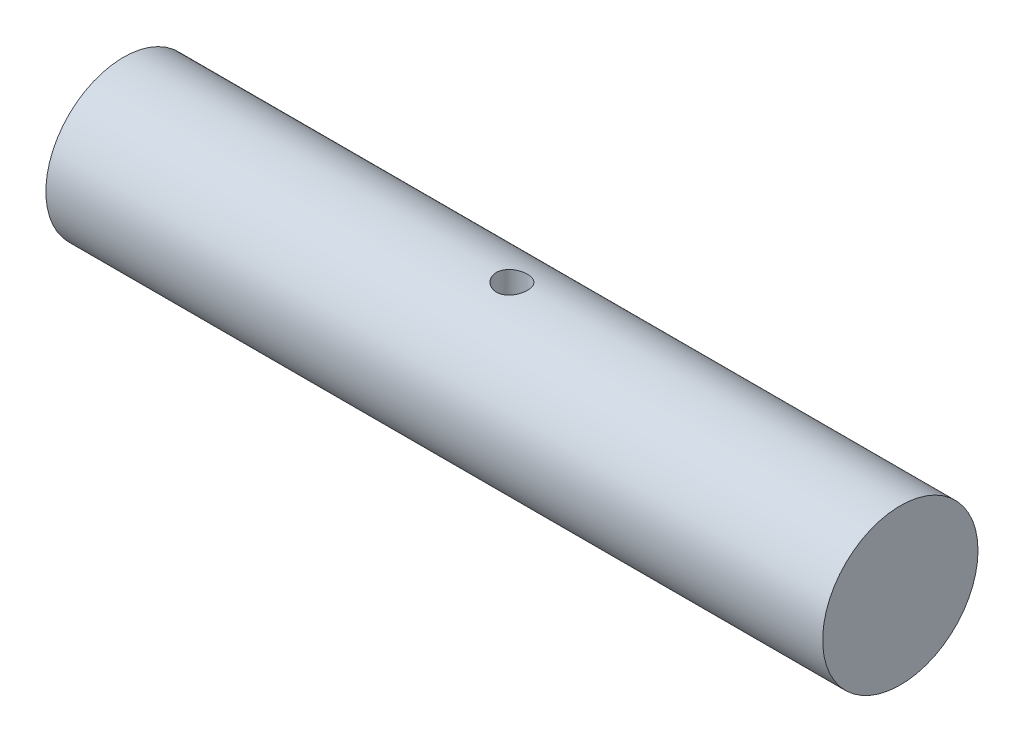
ISO-10303-21;
HEADER;
FILE_DESCRIPTION(('STEP AP214'),'2;1');
FILE_NAME('part.step','',(''),(''),'','','');
FILE_SCHEMA(('AUTOMOTIVE_DESIGN { 1 0 10303 214 1 1 1 1 }'));
ENDSEC;
DATA;
#1=APPLICATION_CONTEXT('core data for automotive mechanical design processes');
#2=APPLICATION_PROTOCOL_DEFINITION('international standard','automotive_design',2000,#1);
#3=PRODUCT_CONTEXT('',#1,'mechanical');
#4=PRODUCT('Part','Part','',(#3));
#5=PRODUCT_RELATED_PRODUCT_CATEGORY('part','',(#4));
#6=PRODUCT_DEFINITION_FORMATION('','',#4);
#7=PRODUCT_DEFINITION_CONTEXT('part definition',#1,'design');
#8=PRODUCT_DEFINITION('design','',#6,#7);
#9=PRODUCT_DEFINITION_SHAPE('','',#8);
#10=(LENGTH_UNIT() NAMED_UNIT(*) SI_UNIT(.MILLI.,.METRE.));
#11=(NAMED_UNIT(*) PLANE_ANGLE_UNIT() SI_UNIT($,.RADIAN.));
#12=(NAMED_UNIT(*) SI_UNIT($,.STERADIAN.) SOLID_ANGLE_UNIT());
#13=UNCERTAINTY_MEASURE_WITH_UNIT(LENGTH_MEASURE(1.E-05),#10,'distance_accuracy_value','');
#14=(GEOMETRIC_REPRESENTATION_CONTEXT(3) GLOBAL_UNCERTAINTY_ASSIGNED_CONTEXT((#13)) GLOBAL_UNIT_ASSIGNED_CONTEXT((#10,
#11,#12)) REPRESENTATION_CONTEXT('',''));
#15=CARTESIAN_POINT('',(0.,0.,0.));
#16=DIRECTION('',(0.,0.,1.));
#17=DIRECTION('',(1.,0.,0.));
#18=AXIS2_PLACEMENT_3D('',#15,#16,#17);
#19=CARTESIAN_POINT('',(125.,0.,0.));
#20=DIRECTION('',(-1.,0.,0.));
#21=DIRECTION('',(0.,0.,1.));
#22=AXIS2_PLACEMENT_3D('',#19,#20,#21);
#23=CYLINDRICAL_SURFACE('',#22,25.);
#24=CARTESIAN_POINT('',(-5.,-25.,0.));
#25=CARTESIAN_POINT('',(-5.00000276944634,-25.0000014065203,0.138987493787324));
#26=CARTESIAN_POINT('',(-4.99420324928108,-24.9988389427216,0.277940302046087));
#27=CARTESIAN_POINT('',(-4.97105635129736,-24.994224565157,0.554886864496204));
#28=CARTESIAN_POINT('',(-4.95370679489748,-24.9907722194715,0.692880432791919));
#29=CARTESIAN_POINT('',(-4.90758143771224,-24.981670242636,0.96693714850388));
#30=CARTESIAN_POINT('',(-4.87879984551409,-24.9760194978176,1.10299928122357));
#31=CARTESIAN_POINT('',(-4.81002534910899,-24.9626762565998,1.37221108352448));
#32=CARTESIAN_POINT('',(-4.7700283237777,-24.9549830097359,1.50535966309261));
#33=CARTESIAN_POINT('',(-4.67919625225817,-24.9377804442932,1.76758319373794));
#34=CARTESIAN_POINT('',(-4.6283758297848,-24.9282735779222,1.896663374225));
#35=CARTESIAN_POINT('',(-4.51622401781226,-24.9076944208426,2.15009997814349));
#36=CARTESIAN_POINT('',(-4.45488875234116,-24.8966215531404,2.2744546389337));
#37=CARTESIAN_POINT('',(-4.32219456929056,-24.8732206370355,2.51749782000809));
#38=CARTESIAN_POINT('',(-4.25084014170608,-24.8608931515555,2.63618884664851));
#39=CARTESIAN_POINT('',(-4.09856036475226,-24.8353088041128,2.86722020463685));
#40=CARTESIAN_POINT('',(-4.01763144246466,-24.8220515959613,2.97955814193969));
#41=CARTESIAN_POINT('',(-3.84577119317021,-24.7948114657324,3.1983785388143));
#42=CARTESIAN_POINT('',(-3.75473335664577,-24.780821838943,3.30477652475172));
#43=CARTESIAN_POINT('',(-3.56403766796451,-24.7526457290753,3.50958996762926));
#44=CARTESIAN_POINT('',(-3.46437663408191,-24.738459174971,3.60800245195942));
#45=CARTESIAN_POINT('',(-3.25716556407393,-24.7102933832022,3.79610927604841));
#46=CARTESIAN_POINT('',(-3.14961781123659,-24.6963140869323,3.88580612172819));
#47=CARTESIAN_POINT('',(-2.92729283454244,-24.6689453876667,4.05592901668139));
#48=CARTESIAN_POINT('',(-2.81251295883554,-24.6555562041458,4.13635163435981));
#49=CARTESIAN_POINT('',(-2.57548415685045,-24.6296394657581,4.28798741229219));
#50=CARTESIAN_POINT('',(-2.4531786550123,-24.6171204770982,4.35911381454495));
#51=CARTESIAN_POINT('',(-2.20287125287649,-24.5934353082732,4.49081269831453));
#52=CARTESIAN_POINT('',(-2.07486723801243,-24.5822696361062,4.55138122040544));
#53=CARTESIAN_POINT('',(-1.6837416438572,-24.5513304070068,4.71644727257975));
#54=CARTESIAN_POINT('',(-1.41321932460559,-24.5340820165952,4.8044888260482));
#55=CARTESIAN_POINT('',(-0.864538565206146,-24.508635793463,4.93264780265691));
#56=CARTESIAN_POINT('',(-0.586526670293087,-24.5003223072134,4.97337819482265));
#57=CARTESIAN_POINT('',(-0.0274615011239772,-24.4933199482487,5.00775493418216));
#58=CARTESIAN_POINT('',(0.253591459209596,-24.4946300913956,5.00140609582258));
#59=CARTESIAN_POINT('',(0.806236719928547,-24.5066272442008,4.94227436036826));
#60=CARTESIAN_POINT('',(1.07790777317425,-24.5171725589932,4.89019310186595));
#61=CARTESIAN_POINT('',(1.60857963824175,-24.546227391949,4.7421890224497));
#62=CARTESIAN_POINT('',(1.86757984431989,-24.5647372904543,4.64626410780486));
#63=CARTESIAN_POINT('',(2.36757651014679,-24.6077809023025,4.41262402680007));
#64=CARTESIAN_POINT('',(2.60843945190753,-24.632354484594,4.27463078523214));
#65=CARTESIAN_POINT('',(3.06385419579618,-24.684730944745,3.96096784378848));
#66=CARTESIAN_POINT('',(3.27840296964697,-24.7125341935642,3.78529381392922));
#67=CARTESIAN_POINT('',(3.6791470271563,-24.7688510603976,3.39749968079915));
#68=CARTESIAN_POINT('',(3.86476284328655,-24.797368460096,3.18478080820446));
#69=CARTESIAN_POINT('',(4.19776922751518,-24.8514424361697,2.73092511816778));
#70=CARTESIAN_POINT('',(4.345159305376,-24.8769989745701,2.48978793632426));
#71=CARTESIAN_POINT('',(4.59763754722347,-24.9223345079227,1.98529693496818));
#72=CARTESIAN_POINT('',(4.70265946859707,-24.9421044423773,1.72190909807365));
#73=CARTESIAN_POINT('',(4.86680236981849,-24.9735704494292,1.18074488209619));
#74=CARTESIAN_POINT('',(4.92592890996419,-24.98526750005,0.902970250347199));
#75=CARTESIAN_POINT('',(4.99578226936858,-24.9991335933204,0.345897028150548));
#76=CARTESIAN_POINT('',(5.0073020989149,-25.0014587325673,0.0667016415443218));
#77=CARTESIAN_POINT('',(4.98375070407561,-24.9967525965614,-0.489624670880018));
#78=CARTESIAN_POINT('',(4.94868209878037,-24.9897218472742,-0.766755711869967));
#79=CARTESIAN_POINT('',(4.8336081366968,-24.9671916002008,-1.30852830007856));
#80=CARTESIAN_POINT('',(4.75400967390563,-24.9517688194687,-1.57325974299468));
#81=CARTESIAN_POINT('',(4.55258007032458,-24.9141776037933,-2.08561813620307));
#82=CARTESIAN_POINT('',(4.43074576544514,-24.892008663478,-2.33324380335236));
#83=CARTESIAN_POINT('',(4.14658760866303,-24.8429955738642,-2.80770587332562));
#84=CARTESIAN_POINT('',(3.98378632719944,-24.8160975113418,-3.03425065213174));
#85=CARTESIAN_POINT('',(3.62295381154451,-24.760736752006,-3.45709007722326));
#86=CARTESIAN_POINT('',(3.42491880020732,-24.7322738876682,-3.65338147605435));
#87=CARTESIAN_POINT('',(2.9956341215523,-24.6764651380018,-4.01320302351496));
#88=CARTESIAN_POINT('',(2.76392459020512,-24.6491428619003,-4.17618877400404));
#89=CARTESIAN_POINT('',(2.2759398820373,-24.5992097395686,-4.46092683850573));
#90=CARTESIAN_POINT('',(2.01966568861743,-24.5765987048474,-4.58268080227279));
#91=CARTESIAN_POINT('',(1.49117106774616,-24.5388364729789,-4.78076018011429));
#92=CARTESIAN_POINT('',(1.21904158214295,-24.5236466726876,-4.85732111853824));
#93=CARTESIAN_POINT('',(0.665286950415527,-24.5023739077135,-4.96353963899985));
#94=CARTESIAN_POINT('',(0.383663047477872,-24.4962897554484,-4.9932033375265));
#95=CARTESIAN_POINT('',(-0.0366703889550757,-24.4945288792509,-5.00179339144585));
#96=CARTESIAN_POINT('',(-0.175226568149242,-24.4951330184965,-4.99885021968412));
#97=CARTESIAN_POINT('',(-0.451573795714482,-24.4986714739674,-4.98148651470878));
#98=CARTESIAN_POINT('',(-0.589365114475224,-24.5016049058833,-4.9670703371849));
#99=CARTESIAN_POINT('',(-0.863249015919121,-24.5097212135577,-4.92686276339316));
#100=CARTESIAN_POINT('',(-0.99934098696874,-24.5149048765081,-4.90106738632089));
#101=CARTESIAN_POINT('',(-1.26877990573972,-24.5273664043086,-4.83831799577184));
#102=CARTESIAN_POINT('',(-1.40212781468395,-24.5346435219816,-4.80136796328246));
#103=CARTESIAN_POINT('',(-1.66492270056654,-24.5510651803018,-4.71667811844351));
#104=CARTESIAN_POINT('',(-1.79437724530106,-24.5602057877658,-4.66896100938054));
#105=CARTESIAN_POINT('',(-2.0487516964052,-24.5800998692381,-4.56306801677477));
#106=CARTESIAN_POINT('',(-2.17367318845506,-24.5908527723703,-4.5048958336854));
#107=CARTESIAN_POINT('',(-2.41824756272708,-24.6136768592635,-4.37847423732261));
#108=CARTESIAN_POINT('',(-2.53789823177196,-24.6257485895239,-4.31022064232977));
#109=CARTESIAN_POINT('',(-2.77104924549456,-24.6508678052533,-4.1641570153785));
#110=CARTESIAN_POINT('',(-2.88455168170255,-24.6639149552593,-4.08635026305034));
#111=CARTESIAN_POINT('',(-3.10662673529868,-24.6908640955351,-3.92025868558202));
#112=CARTESIAN_POINT('',(-3.21507953970715,-24.7047769949563,-3.83181538764857));
#113=CARTESIAN_POINT('',(-3.42413829635703,-24.7328525343466,-3.64620484015059));
#114=CARTESIAN_POINT('',(-3.5247469916541,-24.7470150848702,-3.54904066604526));
#115=CARTESIAN_POINT('',(-3.71754062080305,-24.7752095204235,-3.34655721556743));
#116=CARTESIAN_POINT('',(-3.80972053177606,-24.7892413231228,-3.24123314471885));
#117=CARTESIAN_POINT('',(-3.98492694002668,-24.8167717117019,-3.02322778921367));
#118=CARTESIAN_POINT('',(-4.06795679324696,-24.8302704919035,-2.91054922625043));
#119=CARTESIAN_POINT('',(-4.22517389711511,-24.8565085935593,-2.67729343786965));
#120=CARTESIAN_POINT('',(-4.29925523105979,-24.869238066002,-2.55664367436167));
#121=CARTESIAN_POINT('',(-4.43694433521666,-24.8934104051449,-2.30944481023434));
#122=CARTESIAN_POINT('',(-4.50055595131359,-24.9048537437938,-2.18289789785573));
#123=CARTESIAN_POINT('',(-4.61682450350034,-24.9261268452451,-1.9248233263731));
#124=CARTESIAN_POINT('',(-4.66948807030048,-24.9359575839567,-1.79329873940675));
#125=CARTESIAN_POINT('',(-4.763487680713,-24.9537310452209,-1.52618442476761));
#126=CARTESIAN_POINT('',(-4.8048259066209,-24.9616741314688,-1.39059548585458));
#127=CARTESIAN_POINT('',(-4.89322312719739,-24.9788087281562,-1.04920215690347));
#128=CARTESIAN_POINT('',(-4.93320981071554,-24.9867141903289,-0.841457494405878));
#129=CARTESIAN_POINT('',(-4.98659571941881,-24.9973086745575,-0.422448453280689));
#130=CARTESIAN_POINT('',(-4.99999579197194,-24.9999978628663,-0.211184187046264));
#131=CARTESIAN_POINT('',(-5.,-25.,0.));
#132=B_SPLINE_CURVE_WITH_KNOTS('',3,(#24,#25,#26,#27,#28,#29,#30,#31,#32,#33,#34,#35,#36,#37,
#38,#39,#40,#41,#42,#43,#44,#45,#46,#47,#48,#49,#50,#51,#52,#53,#54,#55,#56,#57,#58,#59,#60,#61,
#62,#63,#64,#65,#66,#67,#68,#69,#70,#71,#72,#73,#74,#75,#76,#77,#78,#79,#80,#81,#82,#83,#84,#85,
#86,#87,#88,#89,#90,#91,#92,#93,#94,#95,#96,#97,#98,#99,#100,#101,#102,#103,#104,#105,#106,#107,
#108,#109,#110,#111,#112,#113,#114,#115,#116,#117,#118,#119,#120,#121,#122,#123,#124,#125,#126,
#127,#128,#129,#130,#131),.UNSPECIFIED.,.T.,.F.,(4,2,2,2,2,2,2,2,2,2,2,2,2,2,2,2,2,2,2,2,2,2,2,
2,2,2,2,2,2,2,2,2,2,2,2,2,2,2,2,2,2,2,2,2,2,2,2,2,2,2,2,2,2,4),(0.,0.416777047445417,
0.833632730149863,1.25069985977206,1.66792044248879,2.08458084615619,2.50139517036218,
2.91802329572164,3.33480738770838,3.7564966440872,4.17834216132243,4.60006602836891,
5.02194544187045,5.44751701120412,5.87324783701269,6.72369555497643,7.56299734191929,
8.40221330082507,9.22877443707773,10.0553750494503,10.8875625969434,11.7198458242473,
12.5671007113313,13.4143664637548,14.262951829465,15.1114343716656,15.9457248705771,
16.7799684696572,17.6067107843,18.4335150475649,19.2704413884317,20.1074575040603,
20.9572195157251,21.8069475229371,22.6522071384191,23.4973565033242,23.9127168808878,
24.3279196434016,24.7432677723233,25.1584678424529,25.5728004765726,25.9869867501795,
26.4013453111814,26.8155620171985,27.2369706991647,27.6582313488923,28.0797414220244,
28.5010963808509,28.9270309561325,29.3528087202144,29.7783278548953,30.203764937947,
30.8370559265658,31.4703267306209),.UNSPECIFIED.);
#133=CARTESIAN_POINT('',(-5.,-25.,0.));
#134=VERTEX_POINT('',#133);
#135=EDGE_CURVE('E10',#134,#134,#132,.T.);
#136=ORIENTED_EDGE('',*,*,#135,.T.);
#137=EDGE_LOOP('',(#136));
#138=FACE_BOUND('',#137,.T.);
#139=CARTESIAN_POINT('',(0.,24.4948974278318,5.));
#140=CARTESIAN_POINT('',(-0.138956228432175,24.4948959140652,5.00000277932283));
#141=CARTESIAN_POINT('',(-0.277877759427022,24.4960820445244,4.99420583952395));
#142=CARTESIAN_POINT('',(-0.554760910782418,24.5007881327193,4.97106951247274));
#143=CARTESIAN_POINT('',(-0.692722344806998,24.5043085313918,4.95372794446977));
#144=CARTESIAN_POINT('',(-0.966714129081264,24.5135833999899,4.90762442723258));
#145=CARTESIAN_POINT('',(-1.10274345492746,24.5193390123237,4.8788566379347));
#146=CARTESIAN_POINT('',(-1.37188892080659,24.5329168521693,4.8101161975473));
#147=CARTESIAN_POINT('',(-1.50500396886891,24.5407398404405,4.77013942141009));
#148=CARTESIAN_POINT('',(-1.76715614052518,24.5582115919251,4.679356239882));
#149=CARTESIAN_POINT('',(-1.89619864039772,24.5678578195523,4.62856486213672));
#150=CARTESIAN_POINT('',(-2.14956304127907,24.5887102826167,4.51647818958425));
#151=CARTESIAN_POINT('',(-2.27388318016664,24.5999170932378,4.45517901998884));
#152=CARTESIAN_POINT('',(-2.5168633390302,24.6235656382957,4.32256259117468));
#153=CARTESIAN_POINT('',(-2.63552584385088,24.6360068230559,4.25124978528394));
#154=CARTESIAN_POINT('',(-2.86650780331227,24.6617859698465,4.09905714012307));
#155=CARTESIAN_POINT('',(-2.97882486626249,24.6751242659164,4.0181737286281));
#156=CARTESIAN_POINT('',(-3.19767262714864,24.7024933301151,3.84635941756609));
#157=CARTESIAN_POINT('',(-3.30411496524358,24.7165306060046,3.7553169869603));
#158=CARTESIAN_POINT('',(-3.50901761116524,24.7447550172108,3.56460271884441));
#159=CARTESIAN_POINT('',(-3.60747494602792,24.7589422061409,3.46492769556318));
#160=CARTESIAN_POINT('',(-3.79566965444345,24.7870621737417,3.25767968751707));
#161=CARTESIAN_POINT('',(-3.88540959714398,24.80099502638,3.15010904621878));
#162=CARTESIAN_POINT('',(-4.05561553244616,24.8282290266689,2.92772937682517));
#163=CARTESIAN_POINT('',(-4.13607809534407,24.8415299396397,2.81291769594009));
#164=CARTESIAN_POINT('',(-4.28775992933208,24.867232331661,2.57586269555549));
#165=CARTESIAN_POINT('',(-4.35889618572743,24.8796253494226,2.45356521066842));
#166=CARTESIAN_POINT('',(-4.49061561976306,24.9030409030999,2.20327286170085));
#167=CARTESIAN_POINT('',(-4.55119483884866,24.9140629244939,2.0752758829805));
#168=CARTESIAN_POINT('',(-4.71629352646733,24.9445697433125,1.68417147036292));
#169=CARTESIAN_POINT('',(-4.80435684781525,24.9615274484324,1.41366454176391));
#170=CARTESIAN_POINT('',(-4.9325572950363,24.9865205281948,0.865044260538021));
#171=CARTESIAN_POINT('',(-4.97331059941089,24.9946705178815,0.58707808925146));
#172=CARTESIAN_POINT('',(-5.00774904818614,25.001544855821,0.0281034479881241));
#173=CARTESIAN_POINT('',(-5.00143872813593,25.0002701123409,-0.252904726222841));
#174=CARTESIAN_POINT('',(-4.94237059736807,24.9885220591615,-0.805712786453445));
#175=CARTESIAN_POINT('',(-4.89027551576091,24.9781800029126,-1.07758681729645));
#176=CARTESIAN_POINT('',(-4.74217443608932,24.9496087733464,-1.60865738706756));
#177=CARTESIAN_POINT('',(-4.64616668110936,24.93137928446,-1.86785341829837));
#178=CARTESIAN_POINT('',(-4.41234990787511,24.8888648238832,-2.36809751770485));
#179=CARTESIAN_POINT('',(-4.2742812735962,24.8645424148967,-2.60902092474939));
#180=CARTESIAN_POINT('',(-3.96045458469301,24.812523467553,-3.06452517521266));
#181=CARTESIAN_POINT('',(-3.7846921932812,24.7848265411053,-3.27910298301492));
#182=CARTESIAN_POINT('',(-3.39683189746096,24.7285482199077,-3.67975717013201));
#183=CARTESIAN_POINT('',(-3.18415406849625,24.6999598233212,-3.86527158685728));
#184=CARTESIAN_POINT('',(-2.730417785602,24.6455785794926,-4.19809246189484));
#185=CARTESIAN_POINT('',(-2.48935879501062,24.6197857851305,-4.3453981975471));
#186=CARTESIAN_POINT('',(-1.98489584146561,24.5739023737433,-4.5978140751034));
#187=CARTESIAN_POINT('',(-1.72144516194926,24.5538240781191,-4.7028332392629));
#188=CARTESIAN_POINT('',(-1.1801433812325,24.521823816122,-4.86695170776361));
#189=CARTESIAN_POINT('',(-0.902294161888908,24.5099007867518,-4.9260569968798));
#190=CARTESIAN_POINT('',(-0.345175710012984,24.4957739630664,-4.99583003057767));
#191=CARTESIAN_POINT('',(-0.0660121283522959,24.493407351626,-5.00730929570102));
#192=CARTESIAN_POINT('',(0.490241115924468,24.4982242831088,-4.98368814034094));
#193=CARTESIAN_POINT('',(0.767330895246229,24.5054072844901,-4.94859036116145));
#194=CARTESIAN_POINT('',(1.30884320179901,24.5283616252697,-4.83351104478034));
#195=CARTESIAN_POINT('',(1.57336171646508,24.5440499515026,-4.75396312055877));
#196=CARTESIAN_POINT('',(2.08531639385734,24.5821744668054,-4.55270516017897));
#197=CARTESIAN_POINT('',(2.33275114737079,24.6046112117261,-4.43099165081898));
#198=CARTESIAN_POINT('',(2.80706555462128,24.6540703007231,-4.1470207729206));
#199=CARTESIAN_POINT('',(3.03363524979288,24.6811486029996,-3.98425562210339));
#200=CARTESIAN_POINT('',(3.45654154171395,24.7366861815763,-3.62347762885003));
#201=CARTESIAN_POINT('',(3.65287502295147,24.7651455997886,-3.4254611586761));
#202=CARTESIAN_POINT('',(4.01281286527109,24.8207673304219,-2.99616224784609));
#203=CARTESIAN_POINT('',(4.17586853389528,24.8479030243562,-2.76441580370579));
#204=CARTESIAN_POINT('',(4.46072914686357,24.8973562425148,-2.27633617425512));
#205=CARTESIAN_POINT('',(4.5825358235458,24.9196739690654,-2.02000402205358));
#206=CARTESIAN_POINT('',(4.78064532630623,24.9568652187611,-1.49152568807435));
#207=CARTESIAN_POINT('',(4.85720619263723,24.9717808767,-1.21947909079514));
#208=CARTESIAN_POINT('',(4.96345263724712,24.9926598775445,-0.665901555502932));
#209=CARTESIAN_POINT('',(4.99314386129755,24.9986242986841,-0.384371763979331));
#210=CARTESIAN_POINT('',(5.00180038909471,25.0003623098663,0.0359308696076315));
#211=CARTESIAN_POINT('',(4.99887564200989,24.9997743264358,0.174547706902773));
#212=CARTESIAN_POINT('',(4.98153854083119,24.9963121932555,0.451018250343525));
#213=CARTESIAN_POINT('',(4.96713054343888,24.9934389105404,0.588872225946721));
#214=CARTESIAN_POINT('',(4.92692863683965,24.9854807163608,0.8628829006169));
#215=CARTESIAN_POINT('',(4.90113078415607,24.9803950389143,0.999038995028387));
#216=CARTESIAN_POINT('',(4.83836516551053,24.9681563049873,1.2686070645044));
#217=CARTESIAN_POINT('',(4.8014013926633,24.9610039876105,1.40202000237942));
#218=CARTESIAN_POINT('',(4.71666615796401,24.9448434641995,1.66496388536662));
#219=CARTESIAN_POINT('',(4.66891578522037,24.9358388825964,1.79450185423182));
#220=CARTESIAN_POINT('',(4.56294207731695,24.9162142305196,2.04903823379663));
#221=CARTESIAN_POINT('',(4.50472245389937,24.9055947327996,2.17403823455953));
#222=CARTESIAN_POINT('',(4.37819338299605,24.8830203693368,2.4187611555957));
#223=CARTESIAN_POINT('',(4.3098797873512,24.8710649550885,2.53848187993982));
#224=CARTESIAN_POINT('',(4.16368560734574,24.8461484673941,2.77176194719751));
#225=CARTESIAN_POINT('',(4.08580831288378,24.8331877403362,2.88532338962303));
#226=CARTESIAN_POINT('',(3.91963723250234,24.8063847462598,3.107409439357));
#227=CARTESIAN_POINT('',(3.83119274567195,24.7925314606031,3.21581998719232));
#228=CARTESIAN_POINT('',(3.64558859737661,24.7645291791264,3.42479299282091));
#229=CARTESIAN_POINT('',(3.5484320083593,24.7503802888953,3.52535819417319));
#230=CARTESIAN_POINT('',(3.34597252660902,24.7221657734697,3.71806545178663));
#231=CARTESIAN_POINT('',(3.24066479635567,24.7081002031371,3.81020243422066));
#232=CARTESIAN_POINT('',(3.02270103815523,24.6804587105912,3.98532502872243));
#233=CARTESIAN_POINT('',(2.91004772292782,24.6668826104611,4.06831398902585));
#234=CARTESIAN_POINT('',(2.6768148430827,24.6404498236186,4.22547700693866));
#235=CARTESIAN_POINT('',(2.55616077080287,24.6276028717508,4.29954219421514));
#236=CARTESIAN_POINT('',(2.30895553115726,24.6031736469171,4.43719880973621));
#237=CARTESIAN_POINT('',(2.18240655122683,24.5915909100867,4.50079408397347));
#238=CARTESIAN_POINT('',(1.92432888446366,24.5700331062172,4.61703044134767));
#239=CARTESIAN_POINT('',(1.79280329372797,24.5600570592754,4.6696782069991));
#240=CARTESIAN_POINT('',(1.52568600190167,24.5420037041339,4.76364722951765));
#241=CARTESIAN_POINT('',(1.39009509313648,24.5339260286217,4.80497067776392));
#242=CARTESIAN_POINT('',(1.04878231160884,24.516494143671,4.89330917087387));
#243=CARTESIAN_POINT('',(0.841122048542003,24.5084401426211,4.93326336835889));
#244=CARTESIAN_POINT('',(0.422281082826919,24.4976430260943,4.98660621384694));
#245=CARTESIAN_POINT('',(0.211100501797822,24.4948997275263,4.99999577768878));
#246=CARTESIAN_POINT('',(0.,24.4948974278318,5.));
#247=B_SPLINE_CURVE_WITH_KNOTS('',3,(#139,#140,#141,#142,#143,#144,#145,#146,#147,#148,#149,
#150,#151,#152,#153,#154,#155,#156,#157,#158,#159,#160,#161,#162,#163,#164,#165,#166,#167,#168,
#169,#170,#171,#172,#173,#174,#175,#176,#177,#178,#179,#180,#181,#182,#183,#184,#185,#186,#187,
#188,#189,#190,#191,#192,#193,#194,#195,#196,#197,#198,#199,#200,#201,#202,#203,#204,#205,#206,
#207,#208,#209,#210,#211,#212,#213,#214,#215,#216,#217,#218,#219,#220,#221,#222,#223,#224,#225,
#226,#227,#228,#229,#230,#231,#232,#233,#234,#235,#236,#237,#238,#239,#240,#241,#242,#243,#244,
#245,#246),.UNSPECIFIED.,.T.,.F.,(4,2,2,2,2,2,2,2,2,2,2,2,2,2,2,2,2,2,2,2,2,2,2,2,2,2,2,2,2,2,2,
2,2,2,2,2,2,2,2,2,2,2,2,2,2,2,2,2,2,2,2,2,2,4),(0.,0.416683123532558,0.833444979779736,
1.25042012213458,1.66754891843381,2.08410182437339,2.50080866752238,2.91733077366025,
3.33400883985332,3.75582155231457,4.17779059926178,4.59963490581337,5.02163466502476,
5.44716701587087,5.87285858614629,6.72323197660176,7.5624010084278,8.40148917008619,
9.22862804595065,10.0558000179613,10.8881847753889,11.7206653527771,12.5676559023979,
13.4146624704098,14.2634817229126,15.112190315075,15.9463764545252,16.780515290738,
17.6066556534829,18.4328640820369,19.269841553043,20.1069052078274,20.9568186509895,
21.8066963958222,22.6516792432494,23.4965602988983,23.9121012971265,24.3274847156826,
24.7430120641575,25.158390988859,25.5729647204247,25.9873917587991,26.4019895837877,
26.8164451851411,27.2377409358741,27.6588886906077,28.0802883323103,28.5015332232677,
28.9274855291216,29.3532810158644,29.7788158230356,30.2042682263315,30.8373096537297,
31.4703292560956),.UNSPECIFIED.);
#248=CARTESIAN_POINT('',(0.,24.4948974278318,5.));
#249=VERTEX_POINT('',#248);
#250=EDGE_CURVE('E43',#249,#249,#247,.T.);
#251=ORIENTED_EDGE('',*,*,#250,.T.);
#252=EDGE_LOOP('',(#251));
#253=FACE_BOUND('',#252,.T.);
#254=CARTESIAN_POINT('',(125.,0.,0.));
#255=DIRECTION('',(1.,0.,0.));
#256=DIRECTION('',(0.,0.,-1.));
#257=AXIS2_PLACEMENT_3D('',#254,#255,#256);
#258=CIRCLE('',#257,25.);
#259=CARTESIAN_POINT('',(125.,0.,-25.));
#260=VERTEX_POINT('',#259);
#261=EDGE_CURVE('E47',#260,#260,#258,.T.);
#262=ORIENTED_EDGE('',*,*,#261,.F.);
#263=EDGE_LOOP('',(#262));
#264=FACE_BOUND('',#263,.T.);
#265=CARTESIAN_POINT('',(-125.,0.,0.));
#266=DIRECTION('',(1.,0.,0.));
#267=DIRECTION('',(0.,0.,-1.));
#268=AXIS2_PLACEMENT_3D('',#265,#266,#267);
#269=CIRCLE('',#268,25.);
#270=CARTESIAN_POINT('',(-125.,0.,-25.));
#271=VERTEX_POINT('',#270);
#272=EDGE_CURVE('E51',#271,#271,#269,.T.);
#273=ORIENTED_EDGE('',*,*,#272,.T.);
#274=EDGE_LOOP('',(#273));
#275=FACE_BOUND('',#274,.T.);
#276=ADVANCED_FACE('F32',(#138,#253,#264,#275),#23,.T.);
#277=CARTESIAN_POINT('',(125.,0.,0.));
#278=DIRECTION('',(1.,0.,0.));
#279=DIRECTION('',(0.,0.,-1.));
#280=AXIS2_PLACEMENT_3D('',#277,#278,#279);
#281=PLANE('',#280);
#282=ORIENTED_EDGE('',*,*,#261,.T.);
#283=EDGE_LOOP('',(#282));
#284=FACE_BOUND('',#283,.T.);
#285=ADVANCED_FACE('F63',(#284),#281,.T.);
#286=CARTESIAN_POINT('',(-125.,0.,0.));
#287=DIRECTION('',(1.,0.,0.));
#288=DIRECTION('',(0.,0.,-1.));
#289=AXIS2_PLACEMENT_3D('',#286,#287,#288);
#290=PLANE('',#289);
#291=ORIENTED_EDGE('',*,*,#272,.F.);
#292=EDGE_LOOP('',(#291));
#293=FACE_BOUND('',#292,.T.);
#294=ADVANCED_FACE('F61',(#293),#290,.F.);
#295=CARTESIAN_POINT('',(0.,-25.,0.));
#296=DIRECTION('',(0.,1.,0.));
#297=DIRECTION('',(0.,0.,1.));
#298=AXIS2_PLACEMENT_3D('',#295,#296,#297);
#299=CYLINDRICAL_SURFACE('',#298,5.);
#300=ORIENTED_EDGE('',*,*,#250,.F.);
#301=EDGE_LOOP('',(#300));
#302=FACE_BOUND('',#301,.T.);
#303=ORIENTED_EDGE('',*,*,#135,.F.);
#304=EDGE_LOOP('',(#303));
#305=FACE_BOUND('',#304,.T.);
#306=ADVANCED_FACE('F57',(#302,#305),#299,.F.);
#307=CLOSED_SHELL('',(#276,#285,#294,#306));
#308=MANIFOLD_SOLID_BREP('B2',#307);
#309=ADVANCED_BREP_SHAPE_REPRESENTATION('',(#18,#308),#14);
#310=SHAPE_DEFINITION_REPRESENTATION(#9,#309);
ENDSEC;
END-ISO-10303-21;
